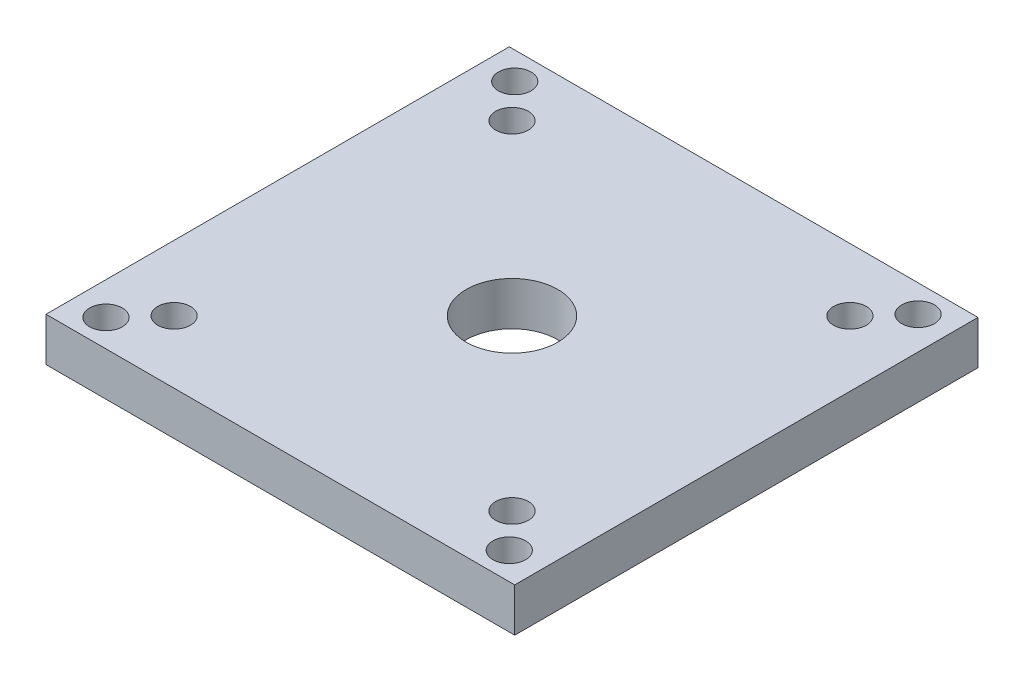
ISO-10303-21;
HEADER;
FILE_DESCRIPTION(('STEP AP214'),'2;1');
FILE_NAME('part.step','',(''),(''),'','','');
FILE_SCHEMA(('AUTOMOTIVE_DESIGN { 1 0 10303 214 1 1 1 1 }'));
ENDSEC;
DATA;
#1=APPLICATION_CONTEXT('core data for automotive mechanical design processes');
#2=APPLICATION_PROTOCOL_DEFINITION('international standard','automotive_design',2000,#1);
#3=PRODUCT_CONTEXT('',#1,'mechanical');
#4=PRODUCT('Part','Part','',(#3));
#5=PRODUCT_RELATED_PRODUCT_CATEGORY('part','',(#4));
#6=PRODUCT_DEFINITION_FORMATION('','',#4);
#7=PRODUCT_DEFINITION_CONTEXT('part definition',#1,'design');
#8=PRODUCT_DEFINITION('design','',#6,#7);
#9=PRODUCT_DEFINITION_SHAPE('','',#8);
#10=(LENGTH_UNIT() NAMED_UNIT(*) SI_UNIT(.MILLI.,.METRE.));
#11=(NAMED_UNIT(*) PLANE_ANGLE_UNIT() SI_UNIT($,.RADIAN.));
#12=(NAMED_UNIT(*) SI_UNIT($,.STERADIAN.) SOLID_ANGLE_UNIT());
#13=UNCERTAINTY_MEASURE_WITH_UNIT(LENGTH_MEASURE(1.E-05),#10,'distance_accuracy_value','');
#14=(GEOMETRIC_REPRESENTATION_CONTEXT(3) GLOBAL_UNCERTAINTY_ASSIGNED_CONTEXT((#13)) GLOBAL_UNIT_ASSIGNED_CONTEXT((#10,
#11,#12)) REPRESENTATION_CONTEXT('',''));
#15=CARTESIAN_POINT('',(0.,0.,0.));
#16=DIRECTION('',(0.,0.,1.));
#17=DIRECTION('',(1.,0.,0.));
#18=AXIS2_PLACEMENT_3D('',#15,#16,#17);
#19=CARTESIAN_POINT('',(-36.5644886833377,4.,-28.9732453580773));
#20=DIRECTION('',(1.,0.,0.));
#21=DIRECTION('',(0.,0.,-1.));
#22=AXIS2_PLACEMENT_3D('',#19,#20,#21);
#23=PLANE('',#22);
#24=DIRECTION('',(0.,0.,1.));
#25=VECTOR('',#24,1.);
#26=CARTESIAN_POINT('',(-36.5644886833377,0.,-28.9732453580773));
#27=LINE('',#26,#25);
#28=CARTESIAN_POINT('',(-36.5644886833377,0.,-28.9732453580773));
#29=VERTEX_POINT('',#28);
#30=CARTESIAN_POINT('',(-36.5644886833377,0.,13.5267546419227));
#31=VERTEX_POINT('',#30);
#32=EDGE_CURVE('E95',#29,#31,#27,.T.);
#33=ORIENTED_EDGE('',*,*,#32,.T.);
#34=DIRECTION('',(0.,-1.,0.));
#35=VECTOR('',#34,1.);
#36=CARTESIAN_POINT('',(-36.5644886833377,4.,13.5267546419227));
#37=LINE('',#36,#35);
#38=CARTESIAN_POINT('',(-36.5644886833377,4.,13.5267546419227));
#39=VERTEX_POINT('',#38);
#40=EDGE_CURVE('E11',#39,#31,#37,.T.);
#41=ORIENTED_EDGE('',*,*,#40,.F.);
#42=DIRECTION('',(0.,0.,1.));
#43=VECTOR('',#42,1.);
#44=CARTESIAN_POINT('',(-36.5644886833377,4.,-28.9732453580773));
#45=LINE('',#44,#43);
#46=CARTESIAN_POINT('',(-36.5644886833377,4.,-28.9732453580773));
#47=VERTEX_POINT('',#46);
#48=EDGE_CURVE('E83',#47,#39,#45,.T.);
#49=ORIENTED_EDGE('',*,*,#48,.F.);
#50=DIRECTION('',(0.,-1.,0.));
#51=VECTOR('',#50,1.);
#52=CARTESIAN_POINT('',(-36.5644886833377,4.,-28.9732453580773));
#53=LINE('',#52,#51);
#54=EDGE_CURVE('E91',#47,#29,#53,.T.);
#55=ORIENTED_EDGE('',*,*,#54,.T.);
#56=EDGE_LOOP('',(#33,#41,#49,#55));
#57=FACE_BOUND('',#56,.T.);
#58=ADVANCED_FACE('F32',(#57),#23,.F.);
#59=CARTESIAN_POINT('',(-36.5644886833377,4.,13.5267546419227));
#60=DIRECTION('',(0.,0.,-1.));
#61=DIRECTION('',(-1.,0.,0.));
#62=AXIS2_PLACEMENT_3D('',#59,#60,#61);
#63=PLANE('',#62);
#64=DIRECTION('',(1.,0.,0.));
#65=VECTOR('',#64,1.);
#66=CARTESIAN_POINT('',(-36.5644886833377,0.,13.5267546419227));
#67=LINE('',#66,#65);
#68=CARTESIAN_POINT('',(6.43551131666229,0.,13.5267546419227));
#69=VERTEX_POINT('',#68);
#70=EDGE_CURVE('E87',#31,#69,#67,.T.);
#71=ORIENTED_EDGE('',*,*,#70,.T.);
#72=DIRECTION('',(0.,-1.,0.));
#73=VECTOR('',#72,1.);
#74=CARTESIAN_POINT('',(6.43551131666229,4.,13.5267546419227));
#75=LINE('',#74,#73);
#76=CARTESIAN_POINT('',(6.43551131666229,4.,13.5267546419227));
#77=VERTEX_POINT('',#76);
#78=EDGE_CURVE('E40',#77,#69,#75,.T.);
#79=ORIENTED_EDGE('',*,*,#78,.F.);
#80=DIRECTION('',(1.,0.,0.));
#81=VECTOR('',#80,1.);
#82=CARTESIAN_POINT('',(-36.5644886833377,4.,13.5267546419227));
#83=LINE('',#82,#81);
#84=EDGE_CURVE('E78',#39,#77,#83,.T.);
#85=ORIENTED_EDGE('',*,*,#84,.F.);
#86=ORIENTED_EDGE('',*,*,#40,.T.);
#87=EDGE_LOOP('',(#71,#79,#85,#86));
#88=FACE_BOUND('',#87,.T.);
#89=ADVANCED_FACE('F86',(#88),#63,.F.);
#90=CARTESIAN_POINT('',(6.43551131666228,4.,-28.9732453580773));
#91=DIRECTION('',(-1.,0.,0.));
#92=DIRECTION('',(0.,0.,1.));
#93=AXIS2_PLACEMENT_3D('',#90,#91,#92);
#94=PLANE('',#93);
#95=DIRECTION('',(0.,0.,-1.));
#96=VECTOR('',#95,1.);
#97=CARTESIAN_POINT('',(6.43551131666228,0.,-28.9732453580773));
#98=LINE('',#97,#96);
#99=CARTESIAN_POINT('',(6.43551131666228,0.,-28.9732453580773));
#100=VERTEX_POINT('',#99);
#101=EDGE_CURVE('E65',#69,#100,#98,.T.);
#102=ORIENTED_EDGE('',*,*,#101,.T.);
#103=DIRECTION('',(0.,-1.,0.));
#104=VECTOR('',#103,1.);
#105=CARTESIAN_POINT('',(6.43551131666228,4.,-28.9732453580773));
#106=LINE('',#105,#104);
#107=CARTESIAN_POINT('',(6.43551131666228,4.,-28.9732453580773));
#108=VERTEX_POINT('',#107);
#109=EDGE_CURVE('E88',#108,#100,#106,.T.);
#110=ORIENTED_EDGE('',*,*,#109,.F.);
#111=DIRECTION('',(0.,0.,-1.));
#112=VECTOR('',#111,1.);
#113=CARTESIAN_POINT('',(6.43551131666228,4.,-28.9732453580773));
#114=LINE('',#113,#112);
#115=EDGE_CURVE('E81',#77,#108,#114,.T.);
#116=ORIENTED_EDGE('',*,*,#115,.F.);
#117=ORIENTED_EDGE('',*,*,#78,.T.);
#118=EDGE_LOOP('',(#102,#110,#116,#117));
#119=FACE_BOUND('',#118,.T.);
#120=ADVANCED_FACE('F89',(#119),#94,.F.);
#121=CARTESIAN_POINT('',(-36.5644886833377,4.,-28.9732453580773));
#122=DIRECTION('',(0.,0.,1.));
#123=DIRECTION('',(1.,0.,0.));
#124=AXIS2_PLACEMENT_3D('',#121,#122,#123);
#125=PLANE('',#124);
#126=DIRECTION('',(-1.,0.,0.));
#127=VECTOR('',#126,1.);
#128=CARTESIAN_POINT('',(-36.5644886833377,0.,-28.9732453580773));
#129=LINE('',#128,#127);
#130=EDGE_CURVE('E71',#100,#29,#129,.T.);
#131=ORIENTED_EDGE('',*,*,#130,.T.);
#132=ORIENTED_EDGE('',*,*,#54,.F.);
#133=DIRECTION('',(-1.,0.,0.));
#134=VECTOR('',#133,1.);
#135=CARTESIAN_POINT('',(-36.5644886833377,4.,-28.9732453580773));
#136=LINE('',#135,#134);
#137=EDGE_CURVE('E48',#108,#47,#136,.T.);
#138=ORIENTED_EDGE('',*,*,#137,.F.);
#139=ORIENTED_EDGE('',*,*,#109,.T.);
#140=EDGE_LOOP('',(#131,#132,#138,#139));
#141=FACE_BOUND('',#140,.T.);
#142=ADVANCED_FACE('F103',(#141),#125,.F.);
#143=CARTESIAN_POINT('',(-36.5644886833377,4.,13.5267546419227));
#144=DIRECTION('',(0.,1.,0.));
#145=DIRECTION('',(0.,0.,1.));
#146=AXIS2_PLACEMENT_3D('',#143,#144,#145);
#147=PLANE('',#146);
#148=CARTESIAN_POINT('',(-15.0644886833377,4.,-7.72324535807727));
#149=DIRECTION('',(0.,1.,0.));
#150=DIRECTION('',(0.,0.,1.));
#151=AXIS2_PLACEMENT_3D('',#148,#149,#150);
#152=CIRCLE('',#151,4.2);
#153=CARTESIAN_POINT('',(-15.0644886833377,4.,-3.52324535807727));
#154=VERTEX_POINT('',#153);
#155=EDGE_CURVE('E157',#154,#154,#152,.T.);
#156=ORIENTED_EDGE('',*,*,#155,.F.);
#157=EDGE_LOOP('',(#156));
#158=FACE_BOUND('',#157,.T.);
#159=CARTESIAN_POINT('',(0.435511316662332,4.,-23.2232453580773));
#160=DIRECTION('',(0.,1.,0.));
#161=DIRECTION('',(0.,0.,1.));
#162=AXIS2_PLACEMENT_3D('',#159,#160,#161);
#163=CIRCLE('',#162,1.5);
#164=CARTESIAN_POINT('',(0.435511316662332,4.,-21.7232453580772));
#165=VERTEX_POINT('',#164);
#166=EDGE_CURVE('E150',#165,#165,#163,.T.);
#167=ORIENTED_EDGE('',*,*,#166,.F.);
#168=EDGE_LOOP('',(#167));
#169=FACE_BOUND('',#168,.T.);
#170=CARTESIAN_POINT('',(0.435511316662349,4.,7.77675464192275));
#171=DIRECTION('',(0.,1.,0.));
#172=DIRECTION('',(0.,0.,1.));
#173=AXIS2_PLACEMENT_3D('',#170,#171,#172);
#174=CIRCLE('',#173,1.5);
#175=CARTESIAN_POINT('',(0.435511316662349,4.,9.27675464192275));
#176=VERTEX_POINT('',#175);
#177=EDGE_CURVE('E144',#176,#176,#174,.T.);
#178=ORIENTED_EDGE('',*,*,#177,.F.);
#179=EDGE_LOOP('',(#178));
#180=FACE_BOUND('',#179,.T.);
#181=CARTESIAN_POINT('',(-30.5644886833377,4.,-23.2232453580773));
#182=DIRECTION('',(0.,1.,0.));
#183=DIRECTION('',(0.,0.,1.));
#184=AXIS2_PLACEMENT_3D('',#181,#182,#183);
#185=CIRCLE('',#184,1.5);
#186=CARTESIAN_POINT('',(-30.5644886833377,4.,-21.7232453580772));
#187=VERTEX_POINT('',#186);
#188=EDGE_CURVE('E138',#187,#187,#185,.T.);
#189=ORIENTED_EDGE('',*,*,#188,.F.);
#190=EDGE_LOOP('',(#189));
#191=FACE_BOUND('',#190,.T.);
#192=CARTESIAN_POINT('',(-30.5644886833377,4.,7.77675464192275));
#193=DIRECTION('',(0.,1.,0.));
#194=DIRECTION('',(0.,0.,1.));
#195=AXIS2_PLACEMENT_3D('',#192,#193,#194);
#196=CIRCLE('',#195,1.5);
#197=CARTESIAN_POINT('',(-30.5644886833377,4.,9.27675464192275));
#198=VERTEX_POINT('',#197);
#199=EDGE_CURVE('E132',#198,#198,#196,.T.);
#200=ORIENTED_EDGE('',*,*,#199,.F.);
#201=EDGE_LOOP('',(#200));
#202=FACE_BOUND('',#201,.T.);
#203=CARTESIAN_POINT('',(3.4355113166623,4.,-26.4732453580773));
#204=DIRECTION('',(0.,1.,0.));
#205=DIRECTION('',(0.,0.,1.));
#206=AXIS2_PLACEMENT_3D('',#203,#204,#205);
#207=CIRCLE('',#206,1.50000000000001);
#208=CARTESIAN_POINT('',(3.4355113166623,4.,-24.9732453580773));
#209=VERTEX_POINT('',#208);
#210=EDGE_CURVE('E126',#209,#209,#207,.T.);
#211=ORIENTED_EDGE('',*,*,#210,.F.);
#212=EDGE_LOOP('',(#211));
#213=FACE_BOUND('',#212,.T.);
#214=CARTESIAN_POINT('',(-33.5644886833377,4.,-26.4732453580773));
#215=DIRECTION('',(0.,1.,0.));
#216=DIRECTION('',(0.,0.,1.));
#217=AXIS2_PLACEMENT_3D('',#214,#215,#216);
#218=CIRCLE('',#217,1.5);
#219=CARTESIAN_POINT('',(-33.5644886833377,4.,-24.9732453580773));
#220=VERTEX_POINT('',#219);
#221=EDGE_CURVE('E120',#220,#220,#218,.T.);
#222=ORIENTED_EDGE('',*,*,#221,.F.);
#223=EDGE_LOOP('',(#222));
#224=FACE_BOUND('',#223,.T.);
#225=CARTESIAN_POINT('',(3.4355113166623,4.,11.0267546419227));
#226=DIRECTION('',(0.,1.,0.));
#227=DIRECTION('',(0.,0.,1.));
#228=AXIS2_PLACEMENT_3D('',#225,#226,#227);
#229=CIRCLE('',#228,1.50000000000001);
#230=CARTESIAN_POINT('',(3.4355113166623,4.,12.5267546419227));
#231=VERTEX_POINT('',#230);
#232=EDGE_CURVE('E114',#231,#231,#229,.T.);
#233=ORIENTED_EDGE('',*,*,#232,.F.);
#234=EDGE_LOOP('',(#233));
#235=FACE_BOUND('',#234,.T.);
#236=CARTESIAN_POINT('',(-33.5644886833377,4.,11.0267546419227));
#237=DIRECTION('',(0.,1.,0.));
#238=DIRECTION('',(0.,0.,1.));
#239=AXIS2_PLACEMENT_3D('',#236,#237,#238);
#240=CIRCLE('',#239,1.5);
#241=CARTESIAN_POINT('',(-33.5644886833377,4.,12.5267546419227));
#242=VERTEX_POINT('',#241);
#243=EDGE_CURVE('E98',#242,#242,#240,.T.);
#244=ORIENTED_EDGE('',*,*,#243,.F.);
#245=EDGE_LOOP('',(#244));
#246=FACE_BOUND('',#245,.T.);
#247=ORIENTED_EDGE('',*,*,#48,.T.);
#248=ORIENTED_EDGE('',*,*,#84,.T.);
#249=ORIENTED_EDGE('',*,*,#115,.T.);
#250=ORIENTED_EDGE('',*,*,#137,.T.);
#251=EDGE_LOOP('',(#247,#248,#249,#250));
#252=FACE_BOUND('',#251,.T.);
#253=ADVANCED_FACE('F79',(#158,#169,#180,#191,#202,#213,#224,#235,#246,#252),#147,.T.);
#254=CARTESIAN_POINT('',(-36.5644886833377,0.,13.5267546419227));
#255=DIRECTION('',(0.,1.,0.));
#256=DIRECTION('',(0.,0.,1.));
#257=AXIS2_PLACEMENT_3D('',#254,#255,#256);
#258=PLANE('',#257);
#259=CARTESIAN_POINT('',(-15.0644886833377,0.,-7.72324535807727));
#260=DIRECTION('',(0.,1.,0.));
#261=DIRECTION('',(0.,0.,1.));
#262=AXIS2_PLACEMENT_3D('',#259,#260,#261);
#263=CIRCLE('',#262,4.2);
#264=CARTESIAN_POINT('',(-15.0644886833377,0.,-3.52324535807727));
#265=VERTEX_POINT('',#264);
#266=EDGE_CURVE('E156',#265,#265,#263,.T.);
#267=ORIENTED_EDGE('',*,*,#266,.T.);
#268=EDGE_LOOP('',(#267));
#269=FACE_BOUND('',#268,.T.);
#270=CARTESIAN_POINT('',(0.435511316662332,0.,-23.2232453580773));
#271=DIRECTION('',(0.,-1.,0.));
#272=DIRECTION('',(0.,0.,-1.));
#273=AXIS2_PLACEMENT_3D('',#270,#271,#272);
#274=CIRCLE('',#273,1.5);
#275=CARTESIAN_POINT('',(0.435511316662332,0.,-24.7232453580773));
#276=VERTEX_POINT('',#275);
#277=EDGE_CURVE('E153',#276,#276,#274,.T.);
#278=ORIENTED_EDGE('',*,*,#277,.F.);
#279=EDGE_LOOP('',(#278));
#280=FACE_BOUND('',#279,.T.);
#281=CARTESIAN_POINT('',(0.435511316662349,0.,7.77675464192275));
#282=DIRECTION('',(0.,-1.,0.));
#283=DIRECTION('',(0.,0.,-1.));
#284=AXIS2_PLACEMENT_3D('',#281,#282,#283);
#285=CIRCLE('',#284,1.5);
#286=CARTESIAN_POINT('',(0.435511316662349,0.,6.27675464192275));
#287=VERTEX_POINT('',#286);
#288=EDGE_CURVE('E147',#287,#287,#285,.T.);
#289=ORIENTED_EDGE('',*,*,#288,.F.);
#290=EDGE_LOOP('',(#289));
#291=FACE_BOUND('',#290,.T.);
#292=CARTESIAN_POINT('',(-30.5644886833377,0.,-23.2232453580773));
#293=DIRECTION('',(0.,-1.,0.));
#294=DIRECTION('',(0.,0.,-1.));
#295=AXIS2_PLACEMENT_3D('',#292,#293,#294);
#296=CIRCLE('',#295,1.5);
#297=CARTESIAN_POINT('',(-30.5644886833377,0.,-24.7232453580773));
#298=VERTEX_POINT('',#297);
#299=EDGE_CURVE('E141',#298,#298,#296,.T.);
#300=ORIENTED_EDGE('',*,*,#299,.F.);
#301=EDGE_LOOP('',(#300));
#302=FACE_BOUND('',#301,.T.);
#303=CARTESIAN_POINT('',(-30.5644886833377,0.,7.77675464192275));
#304=DIRECTION('',(0.,-1.,0.));
#305=DIRECTION('',(0.,0.,-1.));
#306=AXIS2_PLACEMENT_3D('',#303,#304,#305);
#307=CIRCLE('',#306,1.5);
#308=CARTESIAN_POINT('',(-30.5644886833377,0.,6.27675464192274));
#309=VERTEX_POINT('',#308);
#310=EDGE_CURVE('E135',#309,#309,#307,.T.);
#311=ORIENTED_EDGE('',*,*,#310,.F.);
#312=EDGE_LOOP('',(#311));
#313=FACE_BOUND('',#312,.T.);
#314=CARTESIAN_POINT('',(3.4355113166623,0.,-26.4732453580773));
#315=DIRECTION('',(0.,-1.,0.));
#316=DIRECTION('',(0.,0.,-1.));
#317=AXIS2_PLACEMENT_3D('',#314,#315,#316);
#318=CIRCLE('',#317,1.50000000000001);
#319=CARTESIAN_POINT('',(3.4355113166623,0.,-27.9732453580773));
#320=VERTEX_POINT('',#319);
#321=EDGE_CURVE('E129',#320,#320,#318,.T.);
#322=ORIENTED_EDGE('',*,*,#321,.F.);
#323=EDGE_LOOP('',(#322));
#324=FACE_BOUND('',#323,.T.);
#325=CARTESIAN_POINT('',(-33.5644886833377,0.,-26.4732453580773));
#326=DIRECTION('',(0.,-1.,0.));
#327=DIRECTION('',(0.,0.,-1.));
#328=AXIS2_PLACEMENT_3D('',#325,#326,#327);
#329=CIRCLE('',#328,1.5);
#330=CARTESIAN_POINT('',(-33.5644886833377,0.,-27.9732453580773));
#331=VERTEX_POINT('',#330);
#332=EDGE_CURVE('E123',#331,#331,#329,.T.);
#333=ORIENTED_EDGE('',*,*,#332,.F.);
#334=EDGE_LOOP('',(#333));
#335=FACE_BOUND('',#334,.T.);
#336=CARTESIAN_POINT('',(3.4355113166623,0.,11.0267546419227));
#337=DIRECTION('',(0.,-1.,0.));
#338=DIRECTION('',(0.,0.,-1.));
#339=AXIS2_PLACEMENT_3D('',#336,#337,#338);
#340=CIRCLE('',#339,1.50000000000001);
#341=CARTESIAN_POINT('',(3.4355113166623,0.,9.52675464192273));
#342=VERTEX_POINT('',#341);
#343=EDGE_CURVE('E117',#342,#342,#340,.T.);
#344=ORIENTED_EDGE('',*,*,#343,.F.);
#345=EDGE_LOOP('',(#344));
#346=FACE_BOUND('',#345,.T.);
#347=CARTESIAN_POINT('',(-33.5644886833377,0.,11.0267546419227));
#348=DIRECTION('',(0.,-1.,0.));
#349=DIRECTION('',(0.,0.,-1.));
#350=AXIS2_PLACEMENT_3D('',#347,#348,#349);
#351=CIRCLE('',#350,1.5);
#352=CARTESIAN_POINT('',(-33.5644886833377,0.,9.52675464192274));
#353=VERTEX_POINT('',#352);
#354=EDGE_CURVE('E111',#353,#353,#351,.T.);
#355=ORIENTED_EDGE('',*,*,#354,.F.);
#356=EDGE_LOOP('',(#355));
#357=FACE_BOUND('',#356,.T.);
#358=ORIENTED_EDGE('',*,*,#32,.F.);
#359=ORIENTED_EDGE('',*,*,#130,.F.);
#360=ORIENTED_EDGE('',*,*,#101,.F.);
#361=ORIENTED_EDGE('',*,*,#70,.F.);
#362=EDGE_LOOP('',(#358,#359,#360,#361));
#363=FACE_BOUND('',#362,.T.);
#364=ADVANCED_FACE('F106',(#269,#280,#291,#302,#313,#324,#335,#346,#357,#363),#258,.F.);
#365=CARTESIAN_POINT('',(-33.5644886833377,10.,11.0267546419227));
#366=DIRECTION('',(0.,-1.,0.));
#367=DIRECTION('',(0.,0.,-1.));
#368=AXIS2_PLACEMENT_3D('',#365,#366,#367);
#369=CYLINDRICAL_SURFACE('',#368,1.5);
#370=ORIENTED_EDGE('',*,*,#243,.T.);
#371=EDGE_LOOP('',(#370));
#372=FACE_BOUND('',#371,.T.);
#373=ORIENTED_EDGE('',*,*,#354,.T.);
#374=EDGE_LOOP('',(#373));
#375=FACE_BOUND('',#374,.T.);
#376=ADVANCED_FACE('F191',(#372,#375),#369,.F.);
#377=CARTESIAN_POINT('',(3.4355113166623,10.,11.0267546419227));
#378=DIRECTION('',(0.,-1.,0.));
#379=DIRECTION('',(0.,0.,-1.));
#380=AXIS2_PLACEMENT_3D('',#377,#378,#379);
#381=CYLINDRICAL_SURFACE('',#380,1.50000000000001);
#382=ORIENTED_EDGE('',*,*,#232,.T.);
#383=EDGE_LOOP('',(#382));
#384=FACE_BOUND('',#383,.T.);
#385=ORIENTED_EDGE('',*,*,#343,.T.);
#386=EDGE_LOOP('',(#385));
#387=FACE_BOUND('',#386,.T.);
#388=ADVANCED_FACE('F194',(#384,#387),#381,.F.);
#389=CARTESIAN_POINT('',(-33.5644886833377,10.,-26.4732453580773));
#390=DIRECTION('',(0.,-1.,0.));
#391=DIRECTION('',(0.,0.,-1.));
#392=AXIS2_PLACEMENT_3D('',#389,#390,#391);
#393=CYLINDRICAL_SURFACE('',#392,1.5);
#394=ORIENTED_EDGE('',*,*,#221,.T.);
#395=EDGE_LOOP('',(#394));
#396=FACE_BOUND('',#395,.T.);
#397=ORIENTED_EDGE('',*,*,#332,.T.);
#398=EDGE_LOOP('',(#397));
#399=FACE_BOUND('',#398,.T.);
#400=ADVANCED_FACE('F272',(#396,#399),#393,.F.);
#401=CARTESIAN_POINT('',(3.4355113166623,10.,-26.4732453580773));
#402=DIRECTION('',(0.,-1.,0.));
#403=DIRECTION('',(0.,0.,-1.));
#404=AXIS2_PLACEMENT_3D('',#401,#402,#403);
#405=CYLINDRICAL_SURFACE('',#404,1.50000000000001);
#406=ORIENTED_EDGE('',*,*,#210,.T.);
#407=EDGE_LOOP('',(#406));
#408=FACE_BOUND('',#407,.T.);
#409=ORIENTED_EDGE('',*,*,#321,.T.);
#410=EDGE_LOOP('',(#409));
#411=FACE_BOUND('',#410,.T.);
#412=ADVANCED_FACE('F264',(#408,#411),#405,.F.);
#413=CARTESIAN_POINT('',(-30.5644886833377,10.,7.77675464192275));
#414=DIRECTION('',(0.,-1.,0.));
#415=DIRECTION('',(0.,0.,-1.));
#416=AXIS2_PLACEMENT_3D('',#413,#414,#415);
#417=CYLINDRICAL_SURFACE('',#416,1.5);
#418=ORIENTED_EDGE('',*,*,#199,.T.);
#419=EDGE_LOOP('',(#418));
#420=FACE_BOUND('',#419,.T.);
#421=ORIENTED_EDGE('',*,*,#310,.T.);
#422=EDGE_LOOP('',(#421));
#423=FACE_BOUND('',#422,.T.);
#424=ADVANCED_FACE('F256',(#420,#423),#417,.F.);
#425=CARTESIAN_POINT('',(-30.5644886833377,10.,-23.2232453580773));
#426=DIRECTION('',(0.,-1.,0.));
#427=DIRECTION('',(0.,0.,-1.));
#428=AXIS2_PLACEMENT_3D('',#425,#426,#427);
#429=CYLINDRICAL_SURFACE('',#428,1.5);
#430=ORIENTED_EDGE('',*,*,#188,.T.);
#431=EDGE_LOOP('',(#430));
#432=FACE_BOUND('',#431,.T.);
#433=ORIENTED_EDGE('',*,*,#299,.T.);
#434=EDGE_LOOP('',(#433));
#435=FACE_BOUND('',#434,.T.);
#436=ADVANCED_FACE('F248',(#432,#435),#429,.F.);
#437=CARTESIAN_POINT('',(0.435511316662349,10.,7.77675464192275));
#438=DIRECTION('',(0.,-1.,0.));
#439=DIRECTION('',(0.,0.,-1.));
#440=AXIS2_PLACEMENT_3D('',#437,#438,#439);
#441=CYLINDRICAL_SURFACE('',#440,1.5);
#442=ORIENTED_EDGE('',*,*,#177,.T.);
#443=EDGE_LOOP('',(#442));
#444=FACE_BOUND('',#443,.T.);
#445=ORIENTED_EDGE('',*,*,#288,.T.);
#446=EDGE_LOOP('',(#445));
#447=FACE_BOUND('',#446,.T.);
#448=ADVANCED_FACE('F243',(#444,#447),#441,.F.);
#449=CARTESIAN_POINT('',(0.435511316662332,10.,-23.2232453580773));
#450=DIRECTION('',(0.,-1.,0.));
#451=DIRECTION('',(0.,0.,-1.));
#452=AXIS2_PLACEMENT_3D('',#449,#450,#451);
#453=CYLINDRICAL_SURFACE('',#452,1.5);
#454=ORIENTED_EDGE('',*,*,#166,.T.);
#455=EDGE_LOOP('',(#454));
#456=FACE_BOUND('',#455,.T.);
#457=ORIENTED_EDGE('',*,*,#277,.T.);
#458=EDGE_LOOP('',(#457));
#459=FACE_BOUND('',#458,.T.);
#460=ADVANCED_FACE('F168',(#456,#459),#453,.F.);
#461=CARTESIAN_POINT('',(-15.0644886833377,0.,-7.72324535807727));
#462=DIRECTION('',(0.,1.,0.));
#463=DIRECTION('',(0.,0.,1.));
#464=AXIS2_PLACEMENT_3D('',#461,#462,#463);
#465=CYLINDRICAL_SURFACE('',#464,4.2);
#466=ORIENTED_EDGE('',*,*,#266,.F.);
#467=EDGE_LOOP('',(#466));
#468=FACE_BOUND('',#467,.T.);
#469=ORIENTED_EDGE('',*,*,#155,.T.);
#470=EDGE_LOOP('',(#469));
#471=FACE_BOUND('',#470,.T.);
#472=ADVANCED_FACE('F165',(#468,#471),#465,.F.);
#473=CLOSED_SHELL('',(#58,#89,#120,#142,#253,#364,#376,#388,#400,#412,#424,#436,#448,#460,#472));
#474=MANIFOLD_SOLID_BREP('B2',#473);
#475=ADVANCED_BREP_SHAPE_REPRESENTATION('',(#18,#474),#14);
#476=SHAPE_DEFINITION_REPRESENTATION(#9,#475);
ENDSEC;
END-ISO-10303-21;
